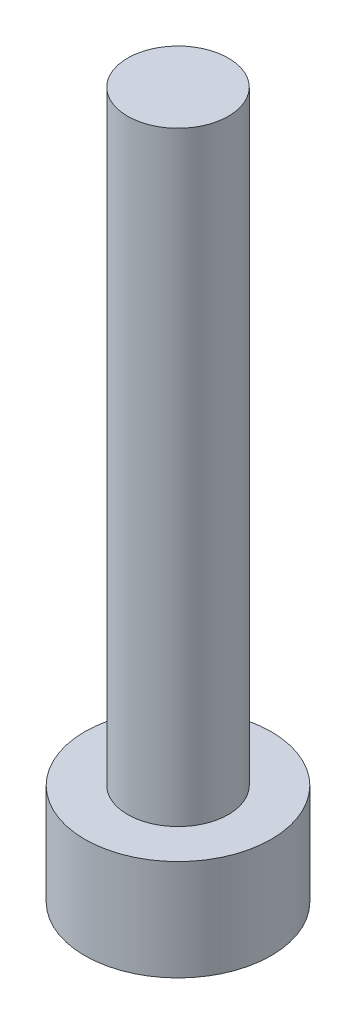
ISO-10303-21;
HEADER;
FILE_DESCRIPTION(('STEP AP214'),'2;1');
FILE_NAME('part.step','',(''),(''),'','','');
FILE_SCHEMA(('AUTOMOTIVE_DESIGN { 1 0 10303 214 1 1 1 1 }'));
ENDSEC;
DATA;
#1=APPLICATION_CONTEXT('core data for automotive mechanical design processes');
#2=APPLICATION_PROTOCOL_DEFINITION('international standard','automotive_design',2000,#1);
#3=PRODUCT_CONTEXT('',#1,'mechanical');
#4=PRODUCT('Part','Part','',(#3));
#5=PRODUCT_RELATED_PRODUCT_CATEGORY('part','',(#4));
#6=PRODUCT_DEFINITION_FORMATION('','',#4);
#7=PRODUCT_DEFINITION_CONTEXT('part definition',#1,'design');
#8=PRODUCT_DEFINITION('design','',#6,#7);
#9=PRODUCT_DEFINITION_SHAPE('','',#8);
#10=(LENGTH_UNIT() NAMED_UNIT(*) SI_UNIT(.MILLI.,.METRE.));
#11=(NAMED_UNIT(*) PLANE_ANGLE_UNIT() SI_UNIT($,.RADIAN.));
#12=(NAMED_UNIT(*) SI_UNIT($,.STERADIAN.) SOLID_ANGLE_UNIT());
#13=UNCERTAINTY_MEASURE_WITH_UNIT(LENGTH_MEASURE(1.E-05),#10,'distance_accuracy_value','');
#14=(GEOMETRIC_REPRESENTATION_CONTEXT(3) GLOBAL_UNCERTAINTY_ASSIGNED_CONTEXT((#13)) GLOBAL_UNIT_ASSIGNED_CONTEXT((#10,
#11,#12)) REPRESENTATION_CONTEXT('',''));
#15=CARTESIAN_POINT('',(0.,0.,0.));
#16=DIRECTION('',(0.,0.,1.));
#17=DIRECTION('',(1.,0.,0.));
#18=AXIS2_PLACEMENT_3D('',#15,#16,#17);
#19=CARTESIAN_POINT('',(0.,2.,0.));
#20=DIRECTION('',(0.,-1.,0.));
#21=DIRECTION('',(0.,0.,-1.));
#22=AXIS2_PLACEMENT_3D('',#19,#20,#21);
#23=CYLINDRICAL_SURFACE('',#22,1.85);
#24=CARTESIAN_POINT('',(0.,2.,0.));
#25=DIRECTION('',(0.,1.,0.));
#26=DIRECTION('',(0.,0.,1.));
#27=AXIS2_PLACEMENT_3D('',#24,#25,#26);
#28=CIRCLE('',#27,1.85);
#29=CARTESIAN_POINT('',(0.,2.,1.85));
#30=VERTEX_POINT('',#29);
#31=EDGE_CURVE('E10',#30,#30,#28,.T.);
#32=ORIENTED_EDGE('',*,*,#31,.F.);
#33=EDGE_LOOP('',(#32));
#34=FACE_BOUND('',#33,.T.);
#35=CARTESIAN_POINT('',(0.,0.,0.));
#36=DIRECTION('',(0.,1.,0.));
#37=DIRECTION('',(0.,0.,1.));
#38=AXIS2_PLACEMENT_3D('',#35,#36,#37);
#39=CIRCLE('',#38,1.85);
#40=CARTESIAN_POINT('',(0.,0.,1.85));
#41=VERTEX_POINT('',#40);
#42=EDGE_CURVE('E34',#41,#41,#39,.T.);
#43=ORIENTED_EDGE('',*,*,#42,.T.);
#44=EDGE_LOOP('',(#43));
#45=FACE_BOUND('',#44,.T.);
#46=ADVANCED_FACE('F31',(#34,#45),#23,.T.);
#47=CARTESIAN_POINT('',(0.,2.,0.));
#48=DIRECTION('',(0.,1.,0.));
#49=DIRECTION('',(0.,0.,1.));
#50=AXIS2_PLACEMENT_3D('',#47,#48,#49);
#51=PLANE('',#50);
#52=CARTESIAN_POINT('',(0.,2.,0.));
#53=DIRECTION('',(0.,1.,0.));
#54=DIRECTION('',(0.,0.,1.));
#55=AXIS2_PLACEMENT_3D('',#52,#53,#54);
#56=CIRCLE('',#55,1.);
#57=CARTESIAN_POINT('',(0.,2.,1.));
#58=VERTEX_POINT('',#57);
#59=EDGE_CURVE('E43',#58,#58,#56,.T.);
#60=ORIENTED_EDGE('',*,*,#59,.F.);
#61=EDGE_LOOP('',(#60));
#62=FACE_BOUND('',#61,.T.);
#63=ORIENTED_EDGE('',*,*,#31,.T.);
#64=EDGE_LOOP('',(#63));
#65=FACE_BOUND('',#64,.T.);
#66=ADVANCED_FACE('F58',(#62,#65),#51,.T.);
#67=CARTESIAN_POINT('',(0.,0.,0.));
#68=DIRECTION('',(0.,1.,0.));
#69=DIRECTION('',(0.,0.,1.));
#70=AXIS2_PLACEMENT_3D('',#67,#68,#69);
#71=PLANE('',#70);
#72=ORIENTED_EDGE('',*,*,#42,.F.);
#73=EDGE_LOOP('',(#72));
#74=FACE_BOUND('',#73,.T.);
#75=ADVANCED_FACE('F54',(#74),#71,.F.);
#76=CARTESIAN_POINT('',(0.,14.,0.));
#77=DIRECTION('',(0.,-1.,0.));
#78=DIRECTION('',(0.,0.,-1.));
#79=AXIS2_PLACEMENT_3D('',#76,#77,#78);
#80=CYLINDRICAL_SURFACE('',#79,1.);
#81=CARTESIAN_POINT('',(0.,14.,0.));
#82=DIRECTION('',(0.,1.,0.));
#83=DIRECTION('',(0.,0.,1.));
#84=AXIS2_PLACEMENT_3D('',#81,#82,#83);
#85=CIRCLE('',#84,1.);
#86=CARTESIAN_POINT('',(0.,14.,1.));
#87=VERTEX_POINT('',#86);
#88=EDGE_CURVE('E41',#87,#87,#85,.T.);
#89=ORIENTED_EDGE('',*,*,#88,.F.);
#90=EDGE_LOOP('',(#89));
#91=FACE_BOUND('',#90,.T.);
#92=ORIENTED_EDGE('',*,*,#59,.T.);
#93=EDGE_LOOP('',(#92));
#94=FACE_BOUND('',#93,.T.);
#95=ADVANCED_FACE('F51',(#91,#94),#80,.T.);
#96=CARTESIAN_POINT('',(0.,14.,0.));
#97=DIRECTION('',(0.,1.,0.));
#98=DIRECTION('',(0.,0.,1.));
#99=AXIS2_PLACEMENT_3D('',#96,#97,#98);
#100=PLANE('',#99);
#101=ORIENTED_EDGE('',*,*,#88,.T.);
#102=EDGE_LOOP('',(#101));
#103=FACE_BOUND('',#102,.T.);
#104=ADVANCED_FACE('F49',(#103),#100,.T.);
#105=CLOSED_SHELL('',(#46,#66,#75,#95,#104));
#106=MANIFOLD_SOLID_BREP('B2',#105);
#107=ADVANCED_BREP_SHAPE_REPRESENTATION('',(#18,#106),#14);
#108=SHAPE_DEFINITION_REPRESENTATION(#9,#107);
ENDSEC;
END-ISO-10303-21;
